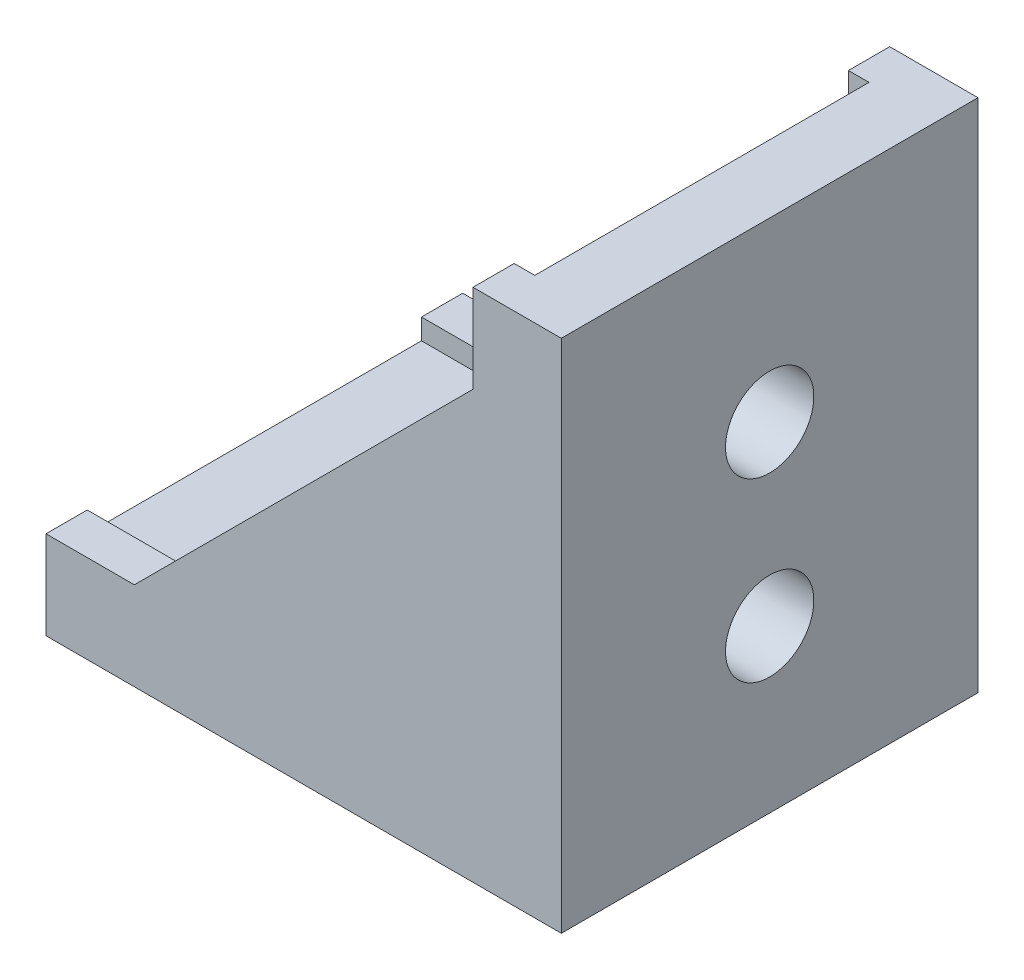
ISO-10303-21;
HEADER;
FILE_DESCRIPTION(('STEP AP214'),'2;1');
FILE_NAME('part.step','',(''),(''),'','','');
FILE_SCHEMA(('AUTOMOTIVE_DESIGN { 1 0 10303 214 1 1 1 1 }'));
ENDSEC;
DATA;
#1=APPLICATION_CONTEXT('core data for automotive mechanical design processes');
#2=APPLICATION_PROTOCOL_DEFINITION('international standard','automotive_design',2000,#1);
#3=PRODUCT_CONTEXT('',#1,'mechanical');
#4=PRODUCT('Part','Part','',(#3));
#5=PRODUCT_RELATED_PRODUCT_CATEGORY('part','',(#4));
#6=PRODUCT_DEFINITION_FORMATION('','',#4);
#7=PRODUCT_DEFINITION_CONTEXT('part definition',#1,'design');
#8=PRODUCT_DEFINITION('design','',#6,#7);
#9=PRODUCT_DEFINITION_SHAPE('','',#8);
#10=(LENGTH_UNIT() NAMED_UNIT(*) SI_UNIT(.MILLI.,.METRE.));
#11=(NAMED_UNIT(*) PLANE_ANGLE_UNIT() SI_UNIT($,.RADIAN.));
#12=(NAMED_UNIT(*) SI_UNIT($,.STERADIAN.) SOLID_ANGLE_UNIT());
#13=UNCERTAINTY_MEASURE_WITH_UNIT(LENGTH_MEASURE(1.E-05),#10,'distance_accuracy_value','');
#14=(GEOMETRIC_REPRESENTATION_CONTEXT(3) GLOBAL_UNCERTAINTY_ASSIGNED_CONTEXT((#13)) GLOBAL_UNIT_ASSIGNED_CONTEXT((#10,
#11,#12)) REPRESENTATION_CONTEXT('',''));
#15=CARTESIAN_POINT('',(0.,0.,0.));
#16=DIRECTION('',(0.,0.,1.));
#17=DIRECTION('',(1.,0.,0.));
#18=AXIS2_PLACEMENT_3D('',#15,#16,#17);
#19=CARTESIAN_POINT('',(29.,35.,14.15));
#20=DIRECTION('',(1.,0.,0.));
#21=DIRECTION('',(0.,0.,-1.));
#22=AXIS2_PLACEMENT_3D('',#19,#20,#21);
#23=PLANE('',#22);
#24=DIRECTION('',(0.,-1.,0.));
#25=VECTOR('',#24,1.);
#26=CARTESIAN_POINT('',(29.,35.,-11.35));
#27=LINE('',#26,#25);
#28=CARTESIAN_POINT('',(29.,35.,-11.35));
#29=VERTEX_POINT('',#28);
#30=CARTESIAN_POINT('',(29.,29.,-11.35));
#31=VERTEX_POINT('',#30);
#32=EDGE_CURVE('E222',#29,#31,#27,.T.);
#33=ORIENTED_EDGE('',*,*,#32,.F.);
#34=DIRECTION('',(0.,0.,-1.));
#35=VECTOR('',#34,1.);
#36=CARTESIAN_POINT('',(29.,35.,14.15));
#37=LINE('',#36,#35);
#38=CARTESIAN_POINT('',(29.,35.,-14.15));
#39=VERTEX_POINT('',#38);
#40=EDGE_CURVE('E131',#29,#39,#37,.T.);
#41=ORIENTED_EDGE('',*,*,#40,.T.);
#42=DIRECTION('',(0.,-1.,0.));
#43=VECTOR('',#42,1.);
#44=CARTESIAN_POINT('',(29.,35.,-14.15));
#45=LINE('',#44,#43);
#46=CARTESIAN_POINT('',(29.,29.,-14.15));
#47=VERTEX_POINT('',#46);
#48=EDGE_CURVE('E150',#39,#47,#45,.T.);
#49=ORIENTED_EDGE('',*,*,#48,.T.);
#50=DIRECTION('',(0.,0.,-1.));
#51=VECTOR('',#50,1.);
#52=CARTESIAN_POINT('',(29.,29.,14.15));
#53=LINE('',#52,#51);
#54=EDGE_CURVE('E132',#31,#47,#53,.T.);
#55=ORIENTED_EDGE('',*,*,#54,.F.);
#56=EDGE_LOOP('',(#33,#41,#49,#55));
#57=FACE_BOUND('',#56,.T.);
#58=ADVANCED_FACE('F35',(#57),#23,.F.);
#59=CARTESIAN_POINT('',(29.,29.,14.15));
#60=DIRECTION('',(0.707106781186547,-0.707106781186547,0.));
#61=DIRECTION('',(0.707106781186548,0.707106781186548,0.));
#62=AXIS2_PLACEMENT_3D('',#59,#60,#61);
#63=PLANE('',#62);
#64=DIRECTION('',(-0.707106781186548,-0.707106781186548,0.));
#65=VECTOR('',#64,1.);
#66=CARTESIAN_POINT('',(29.,29.,-11.35));
#67=LINE('',#66,#65);
#68=CARTESIAN_POINT('',(6.,6.,-11.35));
#69=VERTEX_POINT('',#68);
#70=EDGE_CURVE('E50',#31,#69,#67,.T.);
#71=ORIENTED_EDGE('',*,*,#70,.F.);
#72=ORIENTED_EDGE('',*,*,#54,.T.);
#73=DIRECTION('',(-0.707106781186548,-0.707106781186548,0.));
#74=VECTOR('',#73,1.);
#75=CARTESIAN_POINT('',(29.,29.,-14.15));
#76=LINE('',#75,#74);
#77=CARTESIAN_POINT('',(6.,6.,-14.15));
#78=VERTEX_POINT('',#77);
#79=EDGE_CURVE('E153',#47,#78,#76,.T.);
#80=ORIENTED_EDGE('',*,*,#79,.T.);
#81=DIRECTION('',(0.,0.,-1.));
#82=VECTOR('',#81,1.);
#83=CARTESIAN_POINT('',(6.,6.,14.15));
#84=LINE('',#83,#82);
#85=EDGE_CURVE('E162',#69,#78,#84,.T.);
#86=ORIENTED_EDGE('',*,*,#85,.F.);
#87=EDGE_LOOP('',(#71,#72,#80,#86));
#88=FACE_BOUND('',#87,.T.);
#89=ADVANCED_FACE('F327',(#88),#63,.F.);
#90=CARTESIAN_POINT('',(6.,6.,14.15));
#91=DIRECTION('',(0.,-1.,0.));
#92=DIRECTION('',(1.,0.,0.));
#93=AXIS2_PLACEMENT_3D('',#90,#91,#92);
#94=PLANE('',#93);
#95=DIRECTION('',(-1.,0.,0.));
#96=VECTOR('',#95,1.);
#97=CARTESIAN_POINT('',(6.,6.,-11.35));
#98=LINE('',#97,#96);
#99=CARTESIAN_POINT('',(0.,6.,-11.35));
#100=VERTEX_POINT('',#99);
#101=EDGE_CURVE('E43',#69,#100,#98,.T.);
#102=ORIENTED_EDGE('',*,*,#101,.F.);
#103=ORIENTED_EDGE('',*,*,#85,.T.);
#104=DIRECTION('',(-1.,0.,0.));
#105=VECTOR('',#104,1.);
#106=CARTESIAN_POINT('',(6.,6.,-14.15));
#107=LINE('',#106,#105);
#108=CARTESIAN_POINT('',(0.,6.,-14.15));
#109=VERTEX_POINT('',#108);
#110=EDGE_CURVE('E156',#78,#109,#107,.T.);
#111=ORIENTED_EDGE('',*,*,#110,.T.);
#112=DIRECTION('',(0.,0.,-1.));
#113=VECTOR('',#112,1.);
#114=CARTESIAN_POINT('',(0.,6.,14.15));
#115=LINE('',#114,#113);
#116=EDGE_CURVE('E90',#100,#109,#115,.T.);
#117=ORIENTED_EDGE('',*,*,#116,.F.);
#118=EDGE_LOOP('',(#102,#103,#111,#117));
#119=FACE_BOUND('',#118,.T.);
#120=ADVANCED_FACE('F192',(#119),#94,.F.);
#121=CARTESIAN_POINT('',(0.,6.,14.15));
#122=DIRECTION('',(1.,0.,0.));
#123=DIRECTION('',(0.,1.,0.));
#124=AXIS2_PLACEMENT_3D('',#121,#122,#123);
#125=PLANE('',#124);
#126=CARTESIAN_POINT('',(0.,6.,14.15));
#127=VERTEX_POINT('',#126);
#128=CARTESIAN_POINT('',(0.,6.,11.35));
#129=VERTEX_POINT('',#128);
#130=EDGE_CURVE('E159',#127,#129,#115,.T.);
#131=ORIENTED_EDGE('',*,*,#130,.T.);
#132=DIRECTION('',(0.,-1.,0.));
#133=VECTOR('',#132,1.);
#134=CARTESIAN_POINT('',(0.,35.,11.35));
#135=LINE('',#134,#133);
#136=CARTESIAN_POINT('',(0.,4.59999999999999,11.35));
#137=VERTEX_POINT('',#136);
#138=EDGE_CURVE('E236',#129,#137,#135,.T.);
#139=ORIENTED_EDGE('',*,*,#138,.T.);
#140=DIRECTION('',(0.,0.,-1.));
#141=VECTOR('',#140,1.);
#142=CARTESIAN_POINT('',(0.,4.59999999999999,11.35));
#143=LINE('',#142,#141);
#144=CARTESIAN_POINT('',(0.,4.59999999999999,-11.35));
#145=VERTEX_POINT('',#144);
#146=EDGE_CURVE('E188',#137,#145,#143,.T.);
#147=ORIENTED_EDGE('',*,*,#146,.T.);
#148=DIRECTION('',(0.,-1.,0.));
#149=VECTOR('',#148,1.);
#150=CARTESIAN_POINT('',(0.,35.,-11.35));
#151=LINE('',#150,#149);
#152=EDGE_CURVE('E178',#100,#145,#151,.T.);
#153=ORIENTED_EDGE('',*,*,#152,.F.);
#154=ORIENTED_EDGE('',*,*,#116,.T.);
#155=DIRECTION('',(0.,-1.,0.));
#156=VECTOR('',#155,1.);
#157=CARTESIAN_POINT('',(0.,6.,-14.15));
#158=LINE('',#157,#156);
#159=CARTESIAN_POINT('',(0.,0.,-14.15));
#160=VERTEX_POINT('',#159);
#161=EDGE_CURVE('E141',#109,#160,#158,.T.);
#162=ORIENTED_EDGE('',*,*,#161,.T.);
#163=DIRECTION('',(0.,0.,-1.));
#164=VECTOR('',#163,1.);
#165=CARTESIAN_POINT('',(0.,0.,14.15));
#166=LINE('',#165,#164);
#167=CARTESIAN_POINT('',(0.,0.,14.15));
#168=VERTEX_POINT('',#167);
#169=EDGE_CURVE('E172',#168,#160,#166,.T.);
#170=ORIENTED_EDGE('',*,*,#169,.F.);
#171=DIRECTION('',(0.,-1.,0.));
#172=VECTOR('',#171,1.);
#173=CARTESIAN_POINT('',(0.,6.,14.15));
#174=LINE('',#173,#172);
#175=EDGE_CURVE('E158',#127,#168,#174,.T.);
#176=ORIENTED_EDGE('',*,*,#175,.F.);
#177=EDGE_LOOP('',(#131,#139,#147,#153,#154,#162,#170,#176));
#178=FACE_BOUND('',#177,.T.);
#179=ADVANCED_FACE('F37',(#178),#125,.F.);
#180=CARTESIAN_POINT('',(0.,0.,14.15));
#181=DIRECTION('',(0.,1.,0.));
#182=DIRECTION('',(0.,0.,1.));
#183=AXIS2_PLACEMENT_3D('',#180,#181,#182);
#184=PLANE('',#183);
#185=CARTESIAN_POINT('',(23.,0.,0.));
#186=DIRECTION('',(0.,1.,0.));
#187=DIRECTION('',(0.,0.,1.));
#188=AXIS2_PLACEMENT_3D('',#185,#186,#187);
#189=CIRCLE('',#188,3.);
#190=CARTESIAN_POINT('',(23.,0.,3.));
#191=VERTEX_POINT('',#190);
#192=EDGE_CURVE('E252',#191,#191,#189,.T.);
#193=ORIENTED_EDGE('',*,*,#192,.T.);
#194=EDGE_LOOP('',(#193));
#195=FACE_BOUND('',#194,.T.);
#196=CARTESIAN_POINT('',(11.,0.,0.));
#197=DIRECTION('',(0.,1.,0.));
#198=DIRECTION('',(0.,0.,1.));
#199=AXIS2_PLACEMENT_3D('',#196,#197,#198);
#200=CIRCLE('',#199,3.);
#201=CARTESIAN_POINT('',(11.,0.,3.));
#202=VERTEX_POINT('',#201);
#203=EDGE_CURVE('E253',#202,#202,#200,.T.);
#204=ORIENTED_EDGE('',*,*,#203,.T.);
#205=EDGE_LOOP('',(#204));
#206=FACE_BOUND('',#205,.T.);
#207=DIRECTION('',(1.,0.,0.));
#208=VECTOR('',#207,1.);
#209=CARTESIAN_POINT('',(0.,0.,-14.15));
#210=LINE('',#209,#208);
#211=CARTESIAN_POINT('',(35.,0.,-14.15));
#212=VERTEX_POINT('',#211);
#213=EDGE_CURVE('E143',#160,#212,#210,.T.);
#214=ORIENTED_EDGE('',*,*,#213,.T.);
#215=DIRECTION('',(0.,0.,-1.));
#216=VECTOR('',#215,1.);
#217=CARTESIAN_POINT('',(35.,0.,14.15));
#218=LINE('',#217,#216);
#219=CARTESIAN_POINT('',(35.,0.,14.15));
#220=VERTEX_POINT('',#219);
#221=EDGE_CURVE('E169',#220,#212,#218,.T.);
#222=ORIENTED_EDGE('',*,*,#221,.F.);
#223=DIRECTION('',(1.,0.,0.));
#224=VECTOR('',#223,1.);
#225=CARTESIAN_POINT('',(0.,0.,14.15));
#226=LINE('',#225,#224);
#227=EDGE_CURVE('E99',#168,#220,#226,.T.);
#228=ORIENTED_EDGE('',*,*,#227,.F.);
#229=ORIENTED_EDGE('',*,*,#169,.T.);
#230=EDGE_LOOP('',(#214,#222,#228,#229));
#231=FACE_BOUND('',#230,.T.);
#232=ADVANCED_FACE('F201',(#195,#206,#231),#184,.F.);
#233=CARTESIAN_POINT('',(35.,0.,14.15));
#234=DIRECTION('',(-1.,0.,0.));
#235=DIRECTION('',(0.,0.,1.));
#236=AXIS2_PLACEMENT_3D('',#233,#234,#235);
#237=PLANE('',#236);
#238=CARTESIAN_POINT('',(35.,23.,0.));
#239=DIRECTION('',(-1.,0.,0.));
#240=DIRECTION('',(0.,0.,1.));
#241=AXIS2_PLACEMENT_3D('',#238,#239,#240);
#242=CIRCLE('',#241,3.);
#243=CARTESIAN_POINT('',(35.,23.,3.));
#244=VERTEX_POINT('',#243);
#245=EDGE_CURVE('E267',#244,#244,#242,.T.);
#246=ORIENTED_EDGE('',*,*,#245,.T.);
#247=EDGE_LOOP('',(#246));
#248=FACE_BOUND('',#247,.T.);
#249=CARTESIAN_POINT('',(35.,11.,0.));
#250=DIRECTION('',(-1.,0.,0.));
#251=DIRECTION('',(0.,0.,1.));
#252=AXIS2_PLACEMENT_3D('',#249,#250,#251);
#253=CIRCLE('',#252,3.);
#254=CARTESIAN_POINT('',(35.,11.,3.));
#255=VERTEX_POINT('',#254);
#256=EDGE_CURVE('E261',#255,#255,#253,.T.);
#257=ORIENTED_EDGE('',*,*,#256,.T.);
#258=EDGE_LOOP('',(#257));
#259=FACE_BOUND('',#258,.T.);
#260=DIRECTION('',(0.,1.,0.));
#261=VECTOR('',#260,1.);
#262=CARTESIAN_POINT('',(35.,0.,-14.15));
#263=LINE('',#262,#261);
#264=CARTESIAN_POINT('',(35.,35.,-14.15));
#265=VERTEX_POINT('',#264);
#266=EDGE_CURVE('E145',#212,#265,#263,.T.);
#267=ORIENTED_EDGE('',*,*,#266,.T.);
#268=DIRECTION('',(0.,0.,-1.));
#269=VECTOR('',#268,1.);
#270=CARTESIAN_POINT('',(35.,35.,14.15));
#271=LINE('',#270,#269);
#272=CARTESIAN_POINT('',(35.,35.,14.15));
#273=VERTEX_POINT('',#272);
#274=EDGE_CURVE('E166',#273,#265,#271,.T.);
#275=ORIENTED_EDGE('',*,*,#274,.F.);
#276=DIRECTION('',(0.,1.,0.));
#277=VECTOR('',#276,1.);
#278=CARTESIAN_POINT('',(35.,0.,14.15));
#279=LINE('',#278,#277);
#280=EDGE_CURVE('E206',#220,#273,#279,.T.);
#281=ORIENTED_EDGE('',*,*,#280,.F.);
#282=ORIENTED_EDGE('',*,*,#221,.T.);
#283=EDGE_LOOP('',(#267,#275,#281,#282));
#284=FACE_BOUND('',#283,.T.);
#285=ADVANCED_FACE('F204',(#248,#259,#284),#237,.F.);
#286=CARTESIAN_POINT('',(35.,35.,14.15));
#287=DIRECTION('',(0.,-1.,0.));
#288=DIRECTION('',(0.,0.,-1.));
#289=AXIS2_PLACEMENT_3D('',#286,#287,#288);
#290=PLANE('',#289);
#291=DIRECTION('',(0.,0.,-1.));
#292=VECTOR('',#291,1.);
#293=CARTESIAN_POINT('',(30.4,35.,11.35));
#294=LINE('',#293,#292);
#295=CARTESIAN_POINT('',(30.4,35.,11.35));
#296=VERTEX_POINT('',#295);
#297=CARTESIAN_POINT('',(30.4,35.,-11.35));
#298=VERTEX_POINT('',#297);
#299=EDGE_CURVE('E229',#296,#298,#294,.T.);
#300=ORIENTED_EDGE('',*,*,#299,.F.);
#301=DIRECTION('',(-1.,0.,0.));
#302=VECTOR('',#301,1.);
#303=CARTESIAN_POINT('',(30.4,35.,11.35));
#304=LINE('',#303,#302);
#305=CARTESIAN_POINT('',(29.,35.,11.35));
#306=VERTEX_POINT('',#305);
#307=EDGE_CURVE('E232',#296,#306,#304,.T.);
#308=ORIENTED_EDGE('',*,*,#307,.T.);
#309=CARTESIAN_POINT('',(29.,35.,14.15));
#310=VERTEX_POINT('',#309);
#311=EDGE_CURVE('E164',#310,#306,#37,.T.);
#312=ORIENTED_EDGE('',*,*,#311,.F.);
#313=DIRECTION('',(-1.,0.,0.));
#314=VECTOR('',#313,1.);
#315=CARTESIAN_POINT('',(35.,35.,14.15));
#316=LINE('',#315,#314);
#317=EDGE_CURVE('E118',#273,#310,#316,.T.);
#318=ORIENTED_EDGE('',*,*,#317,.F.);
#319=ORIENTED_EDGE('',*,*,#274,.T.);
#320=DIRECTION('',(-1.,0.,0.));
#321=VECTOR('',#320,1.);
#322=CARTESIAN_POINT('',(35.,35.,-14.15));
#323=LINE('',#322,#321);
#324=EDGE_CURVE('E147',#265,#39,#323,.T.);
#325=ORIENTED_EDGE('',*,*,#324,.T.);
#326=ORIENTED_EDGE('',*,*,#40,.F.);
#327=DIRECTION('',(-1.,0.,0.));
#328=VECTOR('',#327,1.);
#329=CARTESIAN_POINT('',(30.4,35.,-11.35));
#330=LINE('',#329,#328);
#331=EDGE_CURVE('E233',#298,#29,#330,.T.);
#332=ORIENTED_EDGE('',*,*,#331,.F.);
#333=EDGE_LOOP('',(#300,#308,#312,#318,#319,#325,#326,#332));
#334=FACE_BOUND('',#333,.T.);
#335=ADVANCED_FACE('F212',(#334),#290,.F.);
#336=ORIENTED_EDGE('',*,*,#311,.T.);
#337=DIRECTION('',(0.,-1.,0.));
#338=VECTOR('',#337,1.);
#339=CARTESIAN_POINT('',(29.,35.,11.35));
#340=LINE('',#339,#338);
#341=CARTESIAN_POINT('',(29.,29.,11.35));
#342=VERTEX_POINT('',#341);
#343=EDGE_CURVE('E128',#306,#342,#340,.T.);
#344=ORIENTED_EDGE('',*,*,#343,.T.);
#345=CARTESIAN_POINT('',(29.,29.,14.15));
#346=VERTEX_POINT('',#345);
#347=EDGE_CURVE('E125',#346,#342,#53,.T.);
#348=ORIENTED_EDGE('',*,*,#347,.F.);
#349=DIRECTION('',(0.,-1.,0.));
#350=VECTOR('',#349,1.);
#351=CARTESIAN_POINT('',(29.,35.,14.15));
#352=LINE('',#351,#350);
#353=EDGE_CURVE('E111',#310,#346,#352,.T.);
#354=ORIENTED_EDGE('',*,*,#353,.F.);
#355=EDGE_LOOP('',(#336,#344,#348,#354));
#356=FACE_BOUND('',#355,.T.);
#357=ADVANCED_FACE('F126',(#356),#23,.F.);
#358=ORIENTED_EDGE('',*,*,#347,.T.);
#359=DIRECTION('',(-0.707106781186548,-0.707106781186548,0.));
#360=VECTOR('',#359,1.);
#361=CARTESIAN_POINT('',(29.,29.,11.35));
#362=LINE('',#361,#360);
#363=CARTESIAN_POINT('',(6.,6.,11.35));
#364=VERTEX_POINT('',#363);
#365=EDGE_CURVE('E220',#342,#364,#362,.T.);
#366=ORIENTED_EDGE('',*,*,#365,.T.);
#367=CARTESIAN_POINT('',(6.,6.,14.15));
#368=VERTEX_POINT('',#367);
#369=EDGE_CURVE('E136',#368,#364,#84,.T.);
#370=ORIENTED_EDGE('',*,*,#369,.F.);
#371=DIRECTION('',(-0.707106781186548,-0.707106781186548,0.));
#372=VECTOR('',#371,1.);
#373=CARTESIAN_POINT('',(29.,29.,14.15));
#374=LINE('',#373,#372);
#375=EDGE_CURVE('E115',#346,#368,#374,.T.);
#376=ORIENTED_EDGE('',*,*,#375,.F.);
#377=EDGE_LOOP('',(#358,#366,#370,#376));
#378=FACE_BOUND('',#377,.T.);
#379=ADVANCED_FACE('F134',(#378),#63,.F.);
#380=ORIENTED_EDGE('',*,*,#369,.T.);
#381=DIRECTION('',(-1.,0.,0.));
#382=VECTOR('',#381,1.);
#383=CARTESIAN_POINT('',(6.,6.,11.35));
#384=LINE('',#383,#382);
#385=EDGE_CURVE('E11',#364,#129,#384,.T.);
#386=ORIENTED_EDGE('',*,*,#385,.T.);
#387=ORIENTED_EDGE('',*,*,#130,.F.);
#388=DIRECTION('',(-1.,0.,0.));
#389=VECTOR('',#388,1.);
#390=CARTESIAN_POINT('',(6.,6.,14.15));
#391=LINE('',#390,#389);
#392=EDGE_CURVE('E59',#368,#127,#391,.T.);
#393=ORIENTED_EDGE('',*,*,#392,.F.);
#394=EDGE_LOOP('',(#380,#386,#387,#393));
#395=FACE_BOUND('',#394,.T.);
#396=ADVANCED_FACE('F312',(#395),#94,.F.);
#397=CARTESIAN_POINT('',(0.,0.,14.15));
#398=DIRECTION('',(0.,0.,1.));
#399=DIRECTION('',(1.,0.,0.));
#400=AXIS2_PLACEMENT_3D('',#397,#398,#399);
#401=PLANE('',#400);
#402=ORIENTED_EDGE('',*,*,#175,.T.);
#403=ORIENTED_EDGE('',*,*,#227,.T.);
#404=ORIENTED_EDGE('',*,*,#280,.T.);
#405=ORIENTED_EDGE('',*,*,#317,.T.);
#406=ORIENTED_EDGE('',*,*,#353,.T.);
#407=ORIENTED_EDGE('',*,*,#375,.T.);
#408=ORIENTED_EDGE('',*,*,#392,.T.);
#409=EDGE_LOOP('',(#402,#403,#404,#405,#406,#407,#408));
#410=FACE_BOUND('',#409,.T.);
#411=ADVANCED_FACE('F113',(#410),#401,.T.);
#412=CARTESIAN_POINT('',(0.,0.,-14.15));
#413=DIRECTION('',(0.,0.,1.));
#414=DIRECTION('',(1.,0.,0.));
#415=AXIS2_PLACEMENT_3D('',#412,#413,#414);
#416=PLANE('',#415);
#417=ORIENTED_EDGE('',*,*,#161,.F.);
#418=ORIENTED_EDGE('',*,*,#110,.F.);
#419=ORIENTED_EDGE('',*,*,#79,.F.);
#420=ORIENTED_EDGE('',*,*,#48,.F.);
#421=ORIENTED_EDGE('',*,*,#324,.F.);
#422=ORIENTED_EDGE('',*,*,#266,.F.);
#423=ORIENTED_EDGE('',*,*,#213,.F.);
#424=EDGE_LOOP('',(#417,#418,#419,#420,#421,#422,#423));
#425=FACE_BOUND('',#424,.T.);
#426=ADVANCED_FACE('F197',(#425),#416,.F.);
#427=CARTESIAN_POINT('',(0.,0.,11.35));
#428=DIRECTION('',(0.,0.,1.));
#429=DIRECTION('',(1.,0.,0.));
#430=AXIS2_PLACEMENT_3D('',#427,#428,#429);
#431=PLANE('',#430);
#432=ORIENTED_EDGE('',*,*,#307,.F.);
#433=DIRECTION('',(0.,1.,0.));
#434=VECTOR('',#433,1.);
#435=CARTESIAN_POINT('',(30.4,4.59999999999999,11.35));
#436=LINE('',#435,#434);
#437=CARTESIAN_POINT('',(30.4,4.59999999999999,11.35));
#438=VERTEX_POINT('',#437);
#439=EDGE_CURVE('E242',#438,#296,#436,.T.);
#440=ORIENTED_EDGE('',*,*,#439,.F.);
#441=DIRECTION('',(1.,0.,0.));
#442=VECTOR('',#441,1.);
#443=CARTESIAN_POINT('',(0.,4.59999999999999,11.35));
#444=LINE('',#443,#442);
#445=EDGE_CURVE('E245',#137,#438,#444,.T.);
#446=ORIENTED_EDGE('',*,*,#445,.F.);
#447=ORIENTED_EDGE('',*,*,#138,.F.);
#448=ORIENTED_EDGE('',*,*,#385,.F.);
#449=ORIENTED_EDGE('',*,*,#365,.F.);
#450=ORIENTED_EDGE('',*,*,#343,.F.);
#451=EDGE_LOOP('',(#432,#440,#446,#447,#448,#449,#450));
#452=FACE_BOUND('',#451,.T.);
#453=ADVANCED_FACE('F310',(#452),#431,.F.);
#454=CARTESIAN_POINT('',(0.,0.,-11.35));
#455=DIRECTION('',(0.,0.,1.));
#456=DIRECTION('',(1.,0.,0.));
#457=AXIS2_PLACEMENT_3D('',#454,#455,#456);
#458=PLANE('',#457);
#459=ORIENTED_EDGE('',*,*,#32,.T.);
#460=ORIENTED_EDGE('',*,*,#70,.T.);
#461=ORIENTED_EDGE('',*,*,#101,.T.);
#462=ORIENTED_EDGE('',*,*,#152,.T.);
#463=DIRECTION('',(1.,0.,0.));
#464=VECTOR('',#463,1.);
#465=CARTESIAN_POINT('',(0.,4.59999999999999,-11.35));
#466=LINE('',#465,#464);
#467=CARTESIAN_POINT('',(30.4,4.59999999999999,-11.35));
#468=VERTEX_POINT('',#467);
#469=EDGE_CURVE('E189',#145,#468,#466,.T.);
#470=ORIENTED_EDGE('',*,*,#469,.T.);
#471=DIRECTION('',(0.,1.,0.));
#472=VECTOR('',#471,1.);
#473=CARTESIAN_POINT('',(30.4,4.59999999999999,-11.35));
#474=LINE('',#473,#472);
#475=EDGE_CURVE('E237',#468,#298,#474,.T.);
#476=ORIENTED_EDGE('',*,*,#475,.T.);
#477=ORIENTED_EDGE('',*,*,#331,.T.);
#478=EDGE_LOOP('',(#459,#460,#461,#462,#470,#476,#477));
#479=FACE_BOUND('',#478,.T.);
#480=ADVANCED_FACE('F175',(#479),#458,.T.);
#481=CARTESIAN_POINT('',(0.,4.59999999999999,11.35));
#482=DIRECTION('',(0.,1.,0.));
#483=DIRECTION('',(0.,0.,1.));
#484=AXIS2_PLACEMENT_3D('',#481,#482,#483);
#485=PLANE('',#484);
#486=CARTESIAN_POINT('',(23.,4.59999999999999,0.));
#487=DIRECTION('',(0.,1.,0.));
#488=DIRECTION('',(0.,0.,1.));
#489=AXIS2_PLACEMENT_3D('',#486,#487,#488);
#490=CIRCLE('',#489,3.);
#491=CARTESIAN_POINT('',(23.,4.59999999999999,3.));
#492=VERTEX_POINT('',#491);
#493=EDGE_CURVE('E190',#492,#492,#490,.T.);
#494=ORIENTED_EDGE('',*,*,#493,.F.);
#495=EDGE_LOOP('',(#494));
#496=FACE_BOUND('',#495,.T.);
#497=CARTESIAN_POINT('',(11.,4.59999999999999,0.));
#498=DIRECTION('',(0.,1.,0.));
#499=DIRECTION('',(0.,0.,1.));
#500=AXIS2_PLACEMENT_3D('',#497,#498,#499);
#501=CIRCLE('',#500,3.);
#502=CARTESIAN_POINT('',(11.,4.59999999999999,3.));
#503=VERTEX_POINT('',#502);
#504=EDGE_CURVE('E249',#503,#503,#501,.T.);
#505=ORIENTED_EDGE('',*,*,#504,.F.);
#506=EDGE_LOOP('',(#505));
#507=FACE_BOUND('',#506,.T.);
#508=ORIENTED_EDGE('',*,*,#469,.F.);
#509=ORIENTED_EDGE('',*,*,#146,.F.);
#510=ORIENTED_EDGE('',*,*,#445,.T.);
#511=DIRECTION('',(0.,0.,-1.));
#512=VECTOR('',#511,1.);
#513=CARTESIAN_POINT('',(30.4,4.59999999999999,11.35));
#514=LINE('',#513,#512);
#515=EDGE_CURVE('E226',#438,#468,#514,.T.);
#516=ORIENTED_EDGE('',*,*,#515,.T.);
#517=EDGE_LOOP('',(#508,#509,#510,#516));
#518=FACE_BOUND('',#517,.T.);
#519=ADVANCED_FACE('F280',(#496,#507,#518),#485,.T.);
#520=CARTESIAN_POINT('',(30.4,4.59999999999999,11.35));
#521=DIRECTION('',(-1.,0.,0.));
#522=DIRECTION('',(0.,0.,1.));
#523=AXIS2_PLACEMENT_3D('',#520,#521,#522);
#524=PLANE('',#523);
#525=CARTESIAN_POINT('',(30.4,23.,0.));
#526=DIRECTION('',(-1.,0.,0.));
#527=DIRECTION('',(0.,0.,1.));
#528=AXIS2_PLACEMENT_3D('',#525,#526,#527);
#529=CIRCLE('',#528,3.);
#530=CARTESIAN_POINT('',(30.4,23.,3.));
#531=VERTEX_POINT('',#530);
#532=EDGE_CURVE('E256',#531,#531,#529,.T.);
#533=ORIENTED_EDGE('',*,*,#532,.F.);
#534=EDGE_LOOP('',(#533));
#535=FACE_BOUND('',#534,.T.);
#536=CARTESIAN_POINT('',(30.4,11.,0.));
#537=DIRECTION('',(-1.,0.,0.));
#538=DIRECTION('',(0.,0.,1.));
#539=AXIS2_PLACEMENT_3D('',#536,#537,#538);
#540=CIRCLE('',#539,3.);
#541=CARTESIAN_POINT('',(30.4,11.,3.));
#542=VERTEX_POINT('',#541);
#543=EDGE_CURVE('E264',#542,#542,#540,.T.);
#544=ORIENTED_EDGE('',*,*,#543,.F.);
#545=EDGE_LOOP('',(#544));
#546=FACE_BOUND('',#545,.T.);
#547=ORIENTED_EDGE('',*,*,#475,.F.);
#548=ORIENTED_EDGE('',*,*,#515,.F.);
#549=ORIENTED_EDGE('',*,*,#439,.T.);
#550=ORIENTED_EDGE('',*,*,#299,.T.);
#551=EDGE_LOOP('',(#547,#548,#549,#550));
#552=FACE_BOUND('',#551,.T.);
#553=ADVANCED_FACE('F276',(#535,#546,#552),#524,.T.);
#554=CARTESIAN_POINT('',(11.,35.001,0.));
#555=DIRECTION('',(0.,-1.,0.));
#556=DIRECTION('',(0.,0.,-1.));
#557=AXIS2_PLACEMENT_3D('',#554,#555,#556);
#558=CYLINDRICAL_SURFACE('',#557,3.);
#559=ORIENTED_EDGE('',*,*,#504,.T.);
#560=EDGE_LOOP('',(#559));
#561=FACE_BOUND('',#560,.T.);
#562=ORIENTED_EDGE('',*,*,#203,.F.);
#563=EDGE_LOOP('',(#562));
#564=FACE_BOUND('',#563,.T.);
#565=ADVANCED_FACE('F279',(#561,#564),#558,.F.);
#566=CARTESIAN_POINT('',(23.,35.001,0.));
#567=DIRECTION('',(0.,-1.,0.));
#568=DIRECTION('',(0.,0.,-1.));
#569=AXIS2_PLACEMENT_3D('',#566,#567,#568);
#570=CYLINDRICAL_SURFACE('',#569,3.);
#571=ORIENTED_EDGE('',*,*,#493,.T.);
#572=EDGE_LOOP('',(#571));
#573=FACE_BOUND('',#572,.T.);
#574=ORIENTED_EDGE('',*,*,#192,.F.);
#575=EDGE_LOOP('',(#574));
#576=FACE_BOUND('',#575,.T.);
#577=ADVANCED_FACE('F356',(#573,#576),#570,.F.);
#578=CARTESIAN_POINT('',(35.001,11.,0.));
#579=DIRECTION('',(-1.,0.,0.));
#580=DIRECTION('',(0.,0.,1.));
#581=AXIS2_PLACEMENT_3D('',#578,#579,#580);
#582=CYLINDRICAL_SURFACE('',#581,3.);
#583=ORIENTED_EDGE('',*,*,#543,.T.);
#584=EDGE_LOOP('',(#583));
#585=FACE_BOUND('',#584,.T.);
#586=ORIENTED_EDGE('',*,*,#256,.F.);
#587=EDGE_LOOP('',(#586));
#588=FACE_BOUND('',#587,.T.);
#589=ADVANCED_FACE('F362',(#585,#588),#582,.F.);
#590=CARTESIAN_POINT('',(35.001,23.,0.));
#591=DIRECTION('',(-1.,0.,0.));
#592=DIRECTION('',(0.,0.,1.));
#593=AXIS2_PLACEMENT_3D('',#590,#591,#592);
#594=CYLINDRICAL_SURFACE('',#593,3.);
#595=ORIENTED_EDGE('',*,*,#532,.T.);
#596=EDGE_LOOP('',(#595));
#597=FACE_BOUND('',#596,.T.);
#598=ORIENTED_EDGE('',*,*,#245,.F.);
#599=EDGE_LOOP('',(#598));
#600=FACE_BOUND('',#599,.T.);
#601=ADVANCED_FACE('F273',(#597,#600),#594,.F.);
#602=CLOSED_SHELL('',(#58,#89,#120,#179,#232,#285,#335,#357,#379,#396,#411,#426,#453,#480,#519,
#553,#565,#577,#589,#601));
#603=MANIFOLD_SOLID_BREP('B2',#602);
#604=ADVANCED_BREP_SHAPE_REPRESENTATION('',(#18,#603),#14);
#605=SHAPE_DEFINITION_REPRESENTATION(#9,#604);
ENDSEC;
END-ISO-10303-21;
